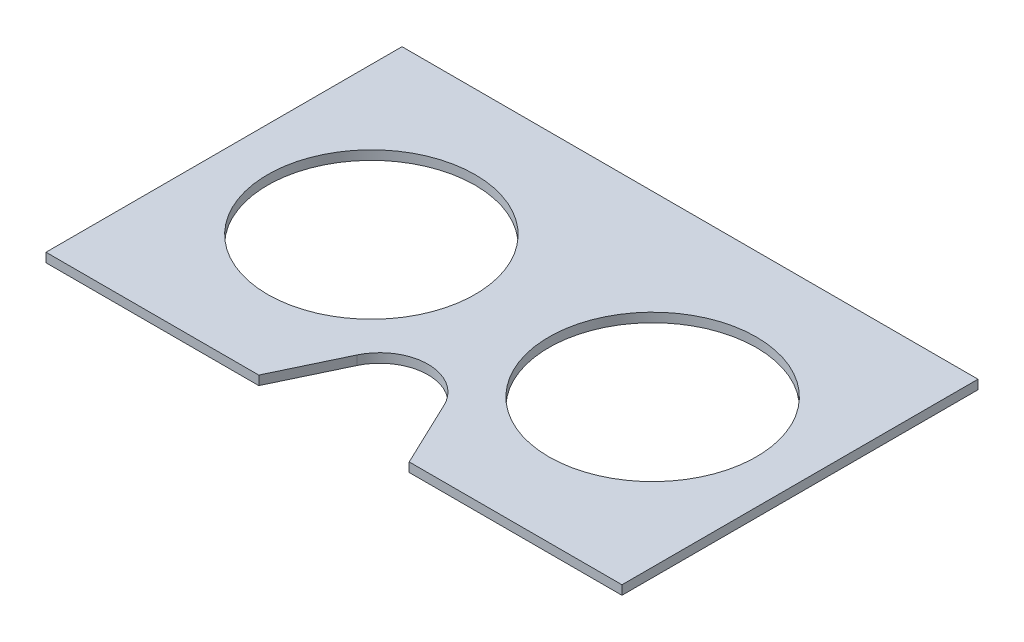
ISO-10303-21;
HEADER;
FILE_DESCRIPTION(('STEP AP214'),'2;1');
FILE_NAME('part.step','',(''),(''),'','','');
FILE_SCHEMA(('AUTOMOTIVE_DESIGN { 1 0 10303 214 1 1 1 1 }'));
ENDSEC;
DATA;
#1=APPLICATION_CONTEXT('core data for automotive mechanical design processes');
#2=APPLICATION_PROTOCOL_DEFINITION('international standard','automotive_design',2000,#1);
#3=PRODUCT_CONTEXT('',#1,'mechanical');
#4=PRODUCT('Part','Part','',(#3));
#5=PRODUCT_RELATED_PRODUCT_CATEGORY('part','',(#4));
#6=PRODUCT_DEFINITION_FORMATION('','',#4);
#7=PRODUCT_DEFINITION_CONTEXT('part definition',#1,'design');
#8=PRODUCT_DEFINITION('design','',#6,#7);
#9=PRODUCT_DEFINITION_SHAPE('','',#8);
#10=(LENGTH_UNIT() NAMED_UNIT(*) SI_UNIT(.MILLI.,.METRE.));
#11=(NAMED_UNIT(*) PLANE_ANGLE_UNIT() SI_UNIT($,.RADIAN.));
#12=(NAMED_UNIT(*) SI_UNIT($,.STERADIAN.) SOLID_ANGLE_UNIT());
#13=UNCERTAINTY_MEASURE_WITH_UNIT(LENGTH_MEASURE(1.E-05),#10,'distance_accuracy_value','');
#14=(GEOMETRIC_REPRESENTATION_CONTEXT(3) GLOBAL_UNCERTAINTY_ASSIGNED_CONTEXT((#13)) GLOBAL_UNIT_ASSIGNED_CONTEXT((#10,
#11,#12)) REPRESENTATION_CONTEXT('',''));
#15=CARTESIAN_POINT('',(0.,0.,0.));
#16=DIRECTION('',(0.,0.,1.));
#17=DIRECTION('',(1.,0.,0.));
#18=AXIS2_PLACEMENT_3D('',#15,#16,#17);
#19=CARTESIAN_POINT('',(62.85,2.,67.7020901521246));
#20=DIRECTION('',(0.,-1.,0.));
#21=DIRECTION('',(0.,0.,-1.));
#22=AXIS2_PLACEMENT_3D('',#19,#20,#21);
#23=PLANE('',#22);
#24=CARTESIAN_POINT('',(32.16,2.,38.85));
#25=DIRECTION('',(0.,1.,0.));
#26=DIRECTION('',(0.,0.,1.));
#27=AXIS2_PLACEMENT_3D('',#24,#25,#26);
#28=CIRCLE('',#27,22.65);
#29=CARTESIAN_POINT('',(32.16,2.,61.5));
#30=VERTEX_POINT('',#29);
#31=EDGE_CURVE('E135',#30,#30,#28,.T.);
#32=ORIENTED_EDGE('',*,*,#31,.F.);
#33=EDGE_LOOP('',(#32));
#34=FACE_BOUND('',#33,.T.);
#35=DIRECTION('',(0.,0.,1.));
#36=VECTOR('',#35,1.);
#37=CARTESIAN_POINT('',(0.,2.,0.));
#38=LINE('',#37,#36);
#39=CARTESIAN_POINT('',(0.,2.,0.));
#40=VERTEX_POINT('',#39);
#41=CARTESIAN_POINT('',(0.,2.,77.7));
#42=VERTEX_POINT('',#41);
#43=EDGE_CURVE('E146',#40,#42,#38,.T.);
#44=ORIENTED_EDGE('',*,*,#43,.T.);
#45=DIRECTION('',(1.,0.,0.));
#46=VECTOR('',#45,1.);
#47=CARTESIAN_POINT('',(0.,2.,77.7));
#48=LINE('',#47,#46);
#49=CARTESIAN_POINT('',(46.435,2.,77.7));
#50=VERTEX_POINT('',#49);
#51=EDGE_CURVE('E94',#42,#50,#48,.T.);
#52=ORIENTED_EDGE('',*,*,#51,.T.);
#53=DIRECTION('',(0.42992954363355,0.,-0.902862441078954));
#54=VECTOR('',#53,1.);
#55=CARTESIAN_POINT('',(46.435,2.,77.7));
#56=LINE('',#55,#54);
#57=CARTESIAN_POINT('',(53.35,2.,63.1783327349506));
#58=VERTEX_POINT('',#57);
#59=EDGE_CURVE('E161',#50,#58,#56,.T.);
#60=ORIENTED_EDGE('',*,*,#59,.T.);
#61=CARTESIAN_POINT('',(62.85,2.,67.7020901521246));
#62=DIRECTION('',(0.,-1.,0.));
#63=DIRECTION('',(0.,0.,-1.));
#64=AXIS2_PLACEMENT_3D('',#61,#62,#63);
#65=CIRCLE('',#64,10.5220901521246);
#66=CARTESIAN_POINT('',(72.35,2.,63.1783327349506));
#67=VERTEX_POINT('',#66);
#68=EDGE_CURVE('E174',#58,#67,#65,.T.);
#69=ORIENTED_EDGE('',*,*,#68,.T.);
#70=DIRECTION('',(0.42992954363355,0.,0.902862441078954));
#71=VECTOR('',#70,1.);
#72=CARTESIAN_POINT('',(79.265,2.,77.7));
#73=LINE('',#72,#71);
#74=CARTESIAN_POINT('',(79.265,2.,77.7));
#75=VERTEX_POINT('',#74);
#76=EDGE_CURVE('E113',#67,#75,#73,.T.);
#77=ORIENTED_EDGE('',*,*,#76,.T.);
#78=DIRECTION('',(1.,0.,0.));
#79=VECTOR('',#78,1.);
#80=CARTESIAN_POINT('',(125.7,2.,77.7));
#81=LINE('',#80,#79);
#82=CARTESIAN_POINT('',(125.7,2.,77.7));
#83=VERTEX_POINT('',#82);
#84=EDGE_CURVE('E107',#75,#83,#81,.T.);
#85=ORIENTED_EDGE('',*,*,#84,.T.);
#86=DIRECTION('',(0.,0.,-1.));
#87=VECTOR('',#86,1.);
#88=CARTESIAN_POINT('',(125.7,2.,0.));
#89=LINE('',#88,#87);
#90=CARTESIAN_POINT('',(125.7,2.,0.));
#91=VERTEX_POINT('',#90);
#92=EDGE_CURVE('E111',#83,#91,#89,.T.);
#93=ORIENTED_EDGE('',*,*,#92,.T.);
#94=DIRECTION('',(-1.,0.,0.));
#95=VECTOR('',#94,1.);
#96=CARTESIAN_POINT('',(0.,2.,0.));
#97=LINE('',#96,#95);
#98=EDGE_CURVE('E51',#91,#40,#97,.T.);
#99=ORIENTED_EDGE('',*,*,#98,.T.);
#100=EDGE_LOOP('',(#44,#52,#60,#69,#77,#85,#93,#99));
#101=FACE_BOUND('',#100,.T.);
#102=CARTESIAN_POINT('',(93.54,2.,38.85));
#103=DIRECTION('',(0.,1.,0.));
#104=DIRECTION('',(0.,0.,1.));
#105=AXIS2_PLACEMENT_3D('',#102,#103,#104);
#106=CIRCLE('',#105,22.65);
#107=CARTESIAN_POINT('',(93.54,2.,61.5));
#108=VERTEX_POINT('',#107);
#109=EDGE_CURVE('E183',#108,#108,#106,.T.);
#110=ORIENTED_EDGE('',*,*,#109,.F.);
#111=EDGE_LOOP('',(#110));
#112=FACE_BOUND('',#111,.T.);
#113=ADVANCED_FACE('F34',(#34,#101,#112),#23,.F.);
#114=CARTESIAN_POINT('',(62.85,0.,67.7020901521246));
#115=DIRECTION('',(0.,-1.,0.));
#116=DIRECTION('',(0.,0.,-1.));
#117=AXIS2_PLACEMENT_3D('',#114,#115,#116);
#118=PLANE('',#117);
#119=CARTESIAN_POINT('',(32.16,0.,38.85));
#120=DIRECTION('',(0.,1.,0.));
#121=DIRECTION('',(0.,0.,1.));
#122=AXIS2_PLACEMENT_3D('',#119,#120,#121);
#123=CIRCLE('',#122,22.65);
#124=CARTESIAN_POINT('',(32.16,0.,61.5));
#125=VERTEX_POINT('',#124);
#126=EDGE_CURVE('E180',#125,#125,#123,.T.);
#127=ORIENTED_EDGE('',*,*,#126,.T.);
#128=EDGE_LOOP('',(#127));
#129=FACE_BOUND('',#128,.T.);
#130=DIRECTION('',(0.,0.,1.));
#131=VECTOR('',#130,1.);
#132=CARTESIAN_POINT('',(0.,0.,0.));
#133=LINE('',#132,#131);
#134=CARTESIAN_POINT('',(0.,0.,0.));
#135=VERTEX_POINT('',#134);
#136=CARTESIAN_POINT('',(0.,0.,77.7));
#137=VERTEX_POINT('',#136);
#138=EDGE_CURVE('E131',#135,#137,#133,.T.);
#139=ORIENTED_EDGE('',*,*,#138,.F.);
#140=DIRECTION('',(-1.,0.,0.));
#141=VECTOR('',#140,1.);
#142=CARTESIAN_POINT('',(0.,0.,0.));
#143=LINE('',#142,#141);
#144=CARTESIAN_POINT('',(125.7,0.,0.));
#145=VERTEX_POINT('',#144);
#146=EDGE_CURVE('E86',#145,#135,#143,.T.);
#147=ORIENTED_EDGE('',*,*,#146,.F.);
#148=DIRECTION('',(0.,0.,-1.));
#149=VECTOR('',#148,1.);
#150=CARTESIAN_POINT('',(125.7,0.,0.));
#151=LINE('',#150,#149);
#152=CARTESIAN_POINT('',(125.7,0.,77.7));
#153=VERTEX_POINT('',#152);
#154=EDGE_CURVE('E80',#153,#145,#151,.T.);
#155=ORIENTED_EDGE('',*,*,#154,.F.);
#156=DIRECTION('',(1.,0.,0.));
#157=VECTOR('',#156,1.);
#158=CARTESIAN_POINT('',(125.7,0.,77.7));
#159=LINE('',#158,#157);
#160=CARTESIAN_POINT('',(79.265,0.,77.7));
#161=VERTEX_POINT('',#160);
#162=EDGE_CURVE('E121',#161,#153,#159,.T.);
#163=ORIENTED_EDGE('',*,*,#162,.F.);
#164=DIRECTION('',(0.42992954363355,0.,0.902862441078954));
#165=VECTOR('',#164,1.);
#166=CARTESIAN_POINT('',(79.265,0.,77.7));
#167=LINE('',#166,#165);
#168=CARTESIAN_POINT('',(72.35,0.,63.1783327349506));
#169=VERTEX_POINT('',#168);
#170=EDGE_CURVE('E141',#169,#161,#167,.T.);
#171=ORIENTED_EDGE('',*,*,#170,.F.);
#172=CARTESIAN_POINT('',(62.85,0.,67.7020901521246));
#173=DIRECTION('',(0.,-1.,0.));
#174=DIRECTION('',(0.,0.,-1.));
#175=AXIS2_PLACEMENT_3D('',#172,#173,#174);
#176=CIRCLE('',#175,10.5220901521246);
#177=CARTESIAN_POINT('',(53.35,0.,63.1783327349506));
#178=VERTEX_POINT('',#177);
#179=EDGE_CURVE('E139',#178,#169,#176,.T.);
#180=ORIENTED_EDGE('',*,*,#179,.F.);
#181=DIRECTION('',(0.42992954363355,0.,-0.902862441078954));
#182=VECTOR('',#181,1.);
#183=CARTESIAN_POINT('',(46.435,0.,77.7));
#184=LINE('',#183,#182);
#185=CARTESIAN_POINT('',(46.435,0.,77.7));
#186=VERTEX_POINT('',#185);
#187=EDGE_CURVE('E137',#186,#178,#184,.T.);
#188=ORIENTED_EDGE('',*,*,#187,.F.);
#189=DIRECTION('',(1.,0.,0.));
#190=VECTOR('',#189,1.);
#191=CARTESIAN_POINT('',(0.,0.,77.7));
#192=LINE('',#191,#190);
#193=EDGE_CURVE('E134',#137,#186,#192,.T.);
#194=ORIENTED_EDGE('',*,*,#193,.F.);
#195=EDGE_LOOP('',(#139,#147,#155,#163,#171,#180,#188,#194));
#196=FACE_BOUND('',#195,.T.);
#197=CARTESIAN_POINT('',(93.54,0.,38.85));
#198=DIRECTION('',(0.,1.,0.));
#199=DIRECTION('',(0.,0.,1.));
#200=AXIS2_PLACEMENT_3D('',#197,#198,#199);
#201=CIRCLE('',#200,22.65);
#202=CARTESIAN_POINT('',(93.54,0.,61.5));
#203=VERTEX_POINT('',#202);
#204=EDGE_CURVE('E186',#203,#203,#201,.T.);
#205=ORIENTED_EDGE('',*,*,#204,.T.);
#206=EDGE_LOOP('',(#205));
#207=FACE_BOUND('',#206,.T.);
#208=ADVANCED_FACE('F165',(#129,#196,#207),#118,.T.);
#209=CARTESIAN_POINT('',(0.,2.,0.));
#210=DIRECTION('',(1.,0.,0.));
#211=DIRECTION('',(0.,0.,-1.));
#212=AXIS2_PLACEMENT_3D('',#209,#210,#211);
#213=PLANE('',#212);
#214=ORIENTED_EDGE('',*,*,#138,.T.);
#215=DIRECTION('',(0.,-1.,0.));
#216=VECTOR('',#215,1.);
#217=CARTESIAN_POINT('',(0.,2.,77.7));
#218=LINE('',#217,#216);
#219=EDGE_CURVE('E11',#42,#137,#218,.T.);
#220=ORIENTED_EDGE('',*,*,#219,.F.);
#221=ORIENTED_EDGE('',*,*,#43,.F.);
#222=DIRECTION('',(0.,-1.,0.));
#223=VECTOR('',#222,1.);
#224=CARTESIAN_POINT('',(0.,2.,0.));
#225=LINE('',#224,#223);
#226=EDGE_CURVE('E127',#40,#135,#225,.T.);
#227=ORIENTED_EDGE('',*,*,#226,.T.);
#228=EDGE_LOOP('',(#214,#220,#221,#227));
#229=FACE_BOUND('',#228,.T.);
#230=ADVANCED_FACE('F36',(#229),#213,.F.);
#231=CARTESIAN_POINT('',(0.,2.,77.7));
#232=DIRECTION('',(0.,0.,-1.));
#233=DIRECTION('',(-1.,0.,0.));
#234=AXIS2_PLACEMENT_3D('',#231,#232,#233);
#235=PLANE('',#234);
#236=ORIENTED_EDGE('',*,*,#193,.T.);
#237=DIRECTION('',(0.,-1.,0.));
#238=VECTOR('',#237,1.);
#239=CARTESIAN_POINT('',(46.435,2.,77.7));
#240=LINE('',#239,#238);
#241=EDGE_CURVE('E43',#50,#186,#240,.T.);
#242=ORIENTED_EDGE('',*,*,#241,.F.);
#243=ORIENTED_EDGE('',*,*,#51,.F.);
#244=ORIENTED_EDGE('',*,*,#219,.T.);
#245=EDGE_LOOP('',(#236,#242,#243,#244));
#246=FACE_BOUND('',#245,.T.);
#247=ADVANCED_FACE('F219',(#246),#235,.F.);
#248=CARTESIAN_POINT('',(46.435,2.,77.7));
#249=DIRECTION('',(-0.902862441078954,0.,-0.42992954363355));
#250=DIRECTION('',(-0.42992954363355,0.,0.902862441078954));
#251=AXIS2_PLACEMENT_3D('',#248,#249,#250);
#252=PLANE('',#251);
#253=ORIENTED_EDGE('',*,*,#187,.T.);
#254=DIRECTION('',(0.,-1.,0.));
#255=VECTOR('',#254,1.);
#256=CARTESIAN_POINT('',(53.35,2.,63.1783327349506));
#257=LINE('',#256,#255);
#258=EDGE_CURVE('E153',#58,#178,#257,.T.);
#259=ORIENTED_EDGE('',*,*,#258,.F.);
#260=ORIENTED_EDGE('',*,*,#59,.F.);
#261=ORIENTED_EDGE('',*,*,#241,.T.);
#262=EDGE_LOOP('',(#253,#259,#260,#261));
#263=FACE_BOUND('',#262,.T.);
#264=ADVANCED_FACE('F159',(#263),#252,.F.);
#265=CARTESIAN_POINT('',(62.85,2.,67.7020901521246));
#266=DIRECTION('',(0.,-1.,0.));
#267=DIRECTION('',(0.,0.,-1.));
#268=AXIS2_PLACEMENT_3D('',#265,#266,#267);
#269=CYLINDRICAL_SURFACE('',#268,10.5220901521246);
#270=ORIENTED_EDGE('',*,*,#179,.T.);
#271=DIRECTION('',(0.,-1.,0.));
#272=VECTOR('',#271,1.);
#273=CARTESIAN_POINT('',(72.35,2.,63.1783327349506));
#274=LINE('',#273,#272);
#275=EDGE_CURVE('E150',#67,#169,#274,.T.);
#276=ORIENTED_EDGE('',*,*,#275,.F.);
#277=ORIENTED_EDGE('',*,*,#68,.F.);
#278=ORIENTED_EDGE('',*,*,#258,.T.);
#279=EDGE_LOOP('',(#270,#276,#277,#278));
#280=FACE_BOUND('',#279,.T.);
#281=ADVANCED_FACE('F170',(#280),#269,.F.);
#282=CARTESIAN_POINT('',(79.265,2.,77.7));
#283=DIRECTION('',(0.902862441078954,0.,-0.42992954363355));
#284=DIRECTION('',(-0.42992954363355,0.,-0.902862441078954));
#285=AXIS2_PLACEMENT_3D('',#282,#283,#284);
#286=PLANE('',#285);
#287=ORIENTED_EDGE('',*,*,#170,.T.);
#288=DIRECTION('',(0.,-1.,0.));
#289=VECTOR('',#288,1.);
#290=CARTESIAN_POINT('',(79.265,2.,77.7));
#291=LINE('',#290,#289);
#292=EDGE_CURVE('E122',#75,#161,#291,.T.);
#293=ORIENTED_EDGE('',*,*,#292,.F.);
#294=ORIENTED_EDGE('',*,*,#76,.F.);
#295=ORIENTED_EDGE('',*,*,#275,.T.);
#296=EDGE_LOOP('',(#287,#293,#294,#295));
#297=FACE_BOUND('',#296,.T.);
#298=ADVANCED_FACE('F173',(#297),#286,.F.);
#299=CARTESIAN_POINT('',(125.7,2.,77.7));
#300=DIRECTION('',(0.,0.,-1.));
#301=DIRECTION('',(-1.,0.,0.));
#302=AXIS2_PLACEMENT_3D('',#299,#300,#301);
#303=PLANE('',#302);
#304=ORIENTED_EDGE('',*,*,#162,.T.);
#305=DIRECTION('',(0.,-1.,0.));
#306=VECTOR('',#305,1.);
#307=CARTESIAN_POINT('',(125.7,2.,77.7));
#308=LINE('',#307,#306);
#309=EDGE_CURVE('E118',#83,#153,#308,.T.);
#310=ORIENTED_EDGE('',*,*,#309,.F.);
#311=ORIENTED_EDGE('',*,*,#84,.F.);
#312=ORIENTED_EDGE('',*,*,#292,.T.);
#313=EDGE_LOOP('',(#304,#310,#311,#312));
#314=FACE_BOUND('',#313,.T.);
#315=ADVANCED_FACE('F119',(#314),#303,.F.);
#316=CARTESIAN_POINT('',(125.7,2.,0.));
#317=DIRECTION('',(-1.,0.,0.));
#318=DIRECTION('',(0.,0.,1.));
#319=AXIS2_PLACEMENT_3D('',#316,#317,#318);
#320=PLANE('',#319);
#321=ORIENTED_EDGE('',*,*,#154,.T.);
#322=DIRECTION('',(0.,-1.,0.));
#323=VECTOR('',#322,1.);
#324=CARTESIAN_POINT('',(125.7,2.,0.));
#325=LINE('',#324,#323);
#326=EDGE_CURVE('E123',#91,#145,#325,.T.);
#327=ORIENTED_EDGE('',*,*,#326,.F.);
#328=ORIENTED_EDGE('',*,*,#92,.F.);
#329=ORIENTED_EDGE('',*,*,#309,.T.);
#330=EDGE_LOOP('',(#321,#327,#328,#329));
#331=FACE_BOUND('',#330,.T.);
#332=ADVANCED_FACE('F125',(#331),#320,.F.);
#333=CARTESIAN_POINT('',(0.,2.,0.));
#334=DIRECTION('',(0.,0.,1.));
#335=DIRECTION('',(1.,0.,0.));
#336=AXIS2_PLACEMENT_3D('',#333,#334,#335);
#337=PLANE('',#336);
#338=ORIENTED_EDGE('',*,*,#146,.T.);
#339=ORIENTED_EDGE('',*,*,#226,.F.);
#340=ORIENTED_EDGE('',*,*,#98,.F.);
#341=ORIENTED_EDGE('',*,*,#326,.T.);
#342=EDGE_LOOP('',(#338,#339,#340,#341));
#343=FACE_BOUND('',#342,.T.);
#344=ADVANCED_FACE('F207',(#343),#337,.F.);
#345=CARTESIAN_POINT('',(32.16,2.,38.85));
#346=DIRECTION('',(0.,-1.,0.));
#347=DIRECTION('',(0.,0.,-1.));
#348=AXIS2_PLACEMENT_3D('',#345,#346,#347);
#349=CYLINDRICAL_SURFACE('',#348,22.65);
#350=ORIENTED_EDGE('',*,*,#31,.T.);
#351=EDGE_LOOP('',(#350));
#352=FACE_BOUND('',#351,.T.);
#353=ORIENTED_EDGE('',*,*,#126,.F.);
#354=EDGE_LOOP('',(#353));
#355=FACE_BOUND('',#354,.T.);
#356=ADVANCED_FACE('F204',(#352,#355),#349,.F.);
#357=CARTESIAN_POINT('',(93.54,2.,38.85));
#358=DIRECTION('',(0.,-1.,0.));
#359=DIRECTION('',(0.,0.,-1.));
#360=AXIS2_PLACEMENT_3D('',#357,#358,#359);
#361=CYLINDRICAL_SURFACE('',#360,22.65);
#362=ORIENTED_EDGE('',*,*,#109,.T.);
#363=EDGE_LOOP('',(#362));
#364=FACE_BOUND('',#363,.T.);
#365=ORIENTED_EDGE('',*,*,#204,.F.);
#366=EDGE_LOOP('',(#365));
#367=FACE_BOUND('',#366,.T.);
#368=ADVANCED_FACE('F192',(#364,#367),#361,.F.);
#369=CLOSED_SHELL('',(#113,#208,#230,#247,#264,#281,#298,#315,#332,#344,#356,#368));
#370=MANIFOLD_SOLID_BREP('B2',#369);
#371=ADVANCED_BREP_SHAPE_REPRESENTATION('',(#18,#370),#14);
#372=SHAPE_DEFINITION_REPRESENTATION(#9,#371);
ENDSEC;
END-ISO-10303-21;
